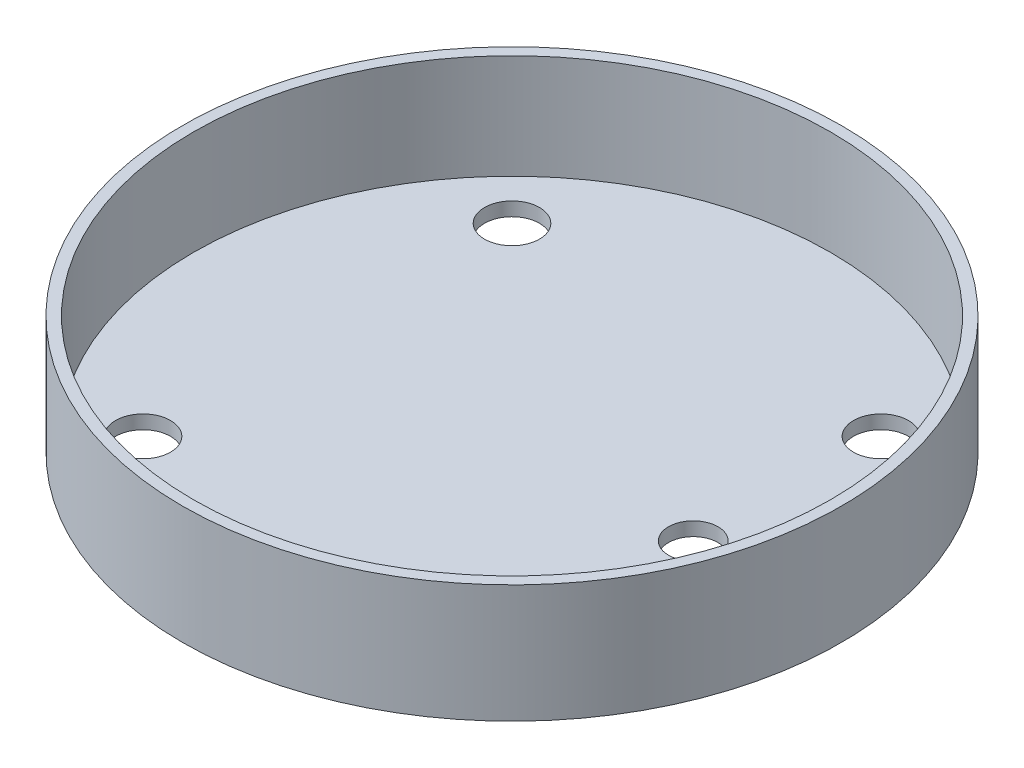
ISO-10303-21;
HEADER;
FILE_DESCRIPTION(('STEP AP214'),'2;1');
FILE_NAME('part.step','',(''),(''),'','','');
FILE_SCHEMA(('AUTOMOTIVE_DESIGN { 1 0 10303 214 1 1 1 1 }'));
ENDSEC;
DATA;
#1=APPLICATION_CONTEXT('core data for automotive mechanical design processes');
#2=APPLICATION_PROTOCOL_DEFINITION('international standard','automotive_design',2000,#1);
#3=PRODUCT_CONTEXT('',#1,'mechanical');
#4=PRODUCT('Part','Part','',(#3));
#5=PRODUCT_RELATED_PRODUCT_CATEGORY('part','',(#4));
#6=PRODUCT_DEFINITION_FORMATION('','',#4);
#7=PRODUCT_DEFINITION_CONTEXT('part definition',#1,'design');
#8=PRODUCT_DEFINITION('design','',#6,#7);
#9=PRODUCT_DEFINITION_SHAPE('','',#8);
#10=(LENGTH_UNIT() NAMED_UNIT(*) SI_UNIT(.MILLI.,.METRE.));
#11=(NAMED_UNIT(*) PLANE_ANGLE_UNIT() SI_UNIT($,.RADIAN.));
#12=(NAMED_UNIT(*) SI_UNIT($,.STERADIAN.) SOLID_ANGLE_UNIT());
#13=UNCERTAINTY_MEASURE_WITH_UNIT(LENGTH_MEASURE(1.E-05),#10,'distance_accuracy_value','');
#14=(GEOMETRIC_REPRESENTATION_CONTEXT(3) GLOBAL_UNCERTAINTY_ASSIGNED_CONTEXT((#13)) GLOBAL_UNIT_ASSIGNED_CONTEXT((#10,
#11,#12)) REPRESENTATION_CONTEXT('',''));
#15=CARTESIAN_POINT('',(0.,0.,0.));
#16=DIRECTION('',(0.,0.,1.));
#17=DIRECTION('',(1.,0.,0.));
#18=AXIS2_PLACEMENT_3D('',#15,#16,#17);
#19=CARTESIAN_POINT('',(0.,2.5,0.));
#20=DIRECTION('',(0.,-1.,0.));
#21=DIRECTION('',(0.,0.,-1.));
#22=AXIS2_PLACEMENT_3D('',#19,#20,#21);
#23=CYLINDRICAL_SURFACE('',#22,60.);
#24=CARTESIAN_POINT('',(0.,0.,0.));
#25=DIRECTION('',(0.,1.,0.));
#26=DIRECTION('',(0.,0.,1.));
#27=AXIS2_PLACEMENT_3D('',#24,#25,#26);
#28=CIRCLE('',#27,60.);
#29=CARTESIAN_POINT('',(0.,0.,60.));
#30=VERTEX_POINT('',#29);
#31=EDGE_CURVE('E41',#30,#30,#28,.T.);
#32=ORIENTED_EDGE('',*,*,#31,.T.);
#33=EDGE_LOOP('',(#32));
#34=FACE_BOUND('',#33,.T.);
#35=CARTESIAN_POINT('',(0.,21.5,0.));
#36=DIRECTION('',(0.,1.,0.));
#37=DIRECTION('',(0.,0.,1.));
#38=AXIS2_PLACEMENT_3D('',#35,#36,#37);
#39=CIRCLE('',#38,60.);
#40=CARTESIAN_POINT('',(0.,21.5,60.));
#41=VERTEX_POINT('',#40);
#42=EDGE_CURVE('E45',#41,#41,#39,.T.);
#43=ORIENTED_EDGE('',*,*,#42,.F.);
#44=EDGE_LOOP('',(#43));
#45=FACE_BOUND('',#44,.T.);
#46=ADVANCED_FACE('F35',(#34,#45),#23,.T.);
#47=CARTESIAN_POINT('',(0.,0.,0.));
#48=DIRECTION('',(0.,1.,0.));
#49=DIRECTION('',(0.,0.,1.));
#50=AXIS2_PLACEMENT_3D('',#47,#48,#49);
#51=PLANE('',#50);
#52=CARTESIAN_POINT('',(-33.5875721063611,0.,-33.5875721063591));
#53=DIRECTION('',(0.,1.,0.));
#54=DIRECTION('',(0.,0.,1.));
#55=AXIS2_PLACEMENT_3D('',#52,#53,#54);
#56=CIRCLE('',#55,5.000000000002);
#57=CARTESIAN_POINT('',(-33.5875721063611,0.,-28.5875721063571));
#58=VERTEX_POINT('',#57);
#59=EDGE_CURVE('E64',#58,#58,#56,.T.);
#60=ORIENTED_EDGE('',*,*,#59,.T.);
#61=EDGE_LOOP('',(#60));
#62=FACE_BOUND('',#61,.T.);
#63=CARTESIAN_POINT('',(-33.5875721063591,0.,33.5875721063629));
#64=DIRECTION('',(0.,1.,0.));
#65=DIRECTION('',(0.,0.,1.));
#66=AXIS2_PLACEMENT_3D('',#63,#64,#65);
#67=CIRCLE('',#66,5.00000000000138);
#68=CARTESIAN_POINT('',(-33.5875721063591,0.,38.5875721063643));
#69=VERTEX_POINT('',#68);
#70=EDGE_CURVE('E70',#69,#69,#67,.T.);
#71=ORIENTED_EDGE('',*,*,#70,.T.);
#72=EDGE_LOOP('',(#71));
#73=FACE_BOUND('',#72,.T.);
#74=CARTESIAN_POINT('',(33.5875721063629,0.,33.5875721063609));
#75=DIRECTION('',(0.,1.,0.));
#76=DIRECTION('',(0.,0.,1.));
#77=AXIS2_PLACEMENT_3D('',#74,#75,#76);
#78=CIRCLE('',#77,4.99999999999954);
#79=CARTESIAN_POINT('',(33.5875721063629,0.,38.5875721063605));
#80=VERTEX_POINT('',#79);
#81=EDGE_CURVE('E76',#80,#80,#78,.T.);
#82=ORIENTED_EDGE('',*,*,#81,.T.);
#83=EDGE_LOOP('',(#82));
#84=FACE_BOUND('',#83,.T.);
#85=CARTESIAN_POINT('',(33.5875721063609,0.,-33.5875721063611));
#86=DIRECTION('',(0.,1.,0.));
#87=DIRECTION('',(0.,0.,1.));
#88=AXIS2_PLACEMENT_3D('',#85,#86,#87);
#89=CIRCLE('',#88,5.);
#90=CARTESIAN_POINT('',(33.5875721063609,0.,-28.5875721063611));
#91=VERTEX_POINT('',#90);
#92=EDGE_CURVE('E58',#91,#91,#89,.T.);
#93=ORIENTED_EDGE('',*,*,#92,.T.);
#94=EDGE_LOOP('',(#93));
#95=FACE_BOUND('',#94,.T.);
#96=CARTESIAN_POINT('',(33.,0.,0.));
#97=DIRECTION('',(0.,1.,0.));
#98=DIRECTION('',(0.,0.,1.));
#99=AXIS2_PLACEMENT_3D('',#96,#97,#98);
#100=CIRCLE('',#99,4.5);
#101=CARTESIAN_POINT('',(33.,0.,4.5));
#102=VERTEX_POINT('',#101);
#103=EDGE_CURVE('E54',#102,#102,#100,.T.);
#104=ORIENTED_EDGE('',*,*,#103,.T.);
#105=EDGE_LOOP('',(#104));
#106=FACE_BOUND('',#105,.T.);
#107=ORIENTED_EDGE('',*,*,#31,.F.);
#108=EDGE_LOOP('',(#107));
#109=FACE_BOUND('',#108,.T.);
#110=ADVANCED_FACE('F85',(#62,#73,#84,#95,#106,#109),#51,.F.);
#111=CARTESIAN_POINT('',(0.,21.5,0.));
#112=DIRECTION('',(0.,1.,0.));
#113=DIRECTION('',(0.,0.,1.));
#114=AXIS2_PLACEMENT_3D('',#111,#112,#113);
#115=PLANE('',#114);
#116=ORIENTED_EDGE('',*,*,#42,.T.);
#117=EDGE_LOOP('',(#116));
#118=FACE_BOUND('',#117,.T.);
#119=CARTESIAN_POINT('',(0.,21.5,0.));
#120=DIRECTION('',(0.,1.,0.));
#121=DIRECTION('',(0.,0.,1.));
#122=AXIS2_PLACEMENT_3D('',#119,#120,#121);
#123=CIRCLE('',#122,58.);
#124=CARTESIAN_POINT('',(0.,21.5,58.));
#125=VERTEX_POINT('',#124);
#126=EDGE_CURVE('E49',#125,#125,#123,.T.);
#127=ORIENTED_EDGE('',*,*,#126,.F.);
#128=EDGE_LOOP('',(#127));
#129=FACE_BOUND('',#128,.T.);
#130=ADVANCED_FACE('F118',(#118,#129),#115,.T.);
#131=CARTESIAN_POINT('',(0.,21.5,0.));
#132=DIRECTION('',(0.,-1.,0.));
#133=DIRECTION('',(0.,0.,-1.));
#134=AXIS2_PLACEMENT_3D('',#131,#132,#133);
#135=CYLINDRICAL_SURFACE('',#134,58.);
#136=ORIENTED_EDGE('',*,*,#126,.T.);
#137=EDGE_LOOP('',(#136));
#138=FACE_BOUND('',#137,.T.);
#139=CARTESIAN_POINT('',(0.,2.5,0.));
#140=DIRECTION('',(0.,1.,0.));
#141=DIRECTION('',(0.,0.,1.));
#142=AXIS2_PLACEMENT_3D('',#139,#140,#141);
#143=CIRCLE('',#142,58.);
#144=CARTESIAN_POINT('',(0.,2.5,58.));
#145=VERTEX_POINT('',#144);
#146=EDGE_CURVE('E10',#145,#145,#143,.F.);
#147=ORIENTED_EDGE('',*,*,#146,.T.);
#148=EDGE_LOOP('',(#147));
#149=FACE_BOUND('',#148,.T.);
#150=ADVANCED_FACE('F99',(#138,#149),#135,.F.);
#151=CARTESIAN_POINT('',(0.,2.5,0.));
#152=DIRECTION('',(0.,1.,0.));
#153=DIRECTION('',(0.,0.,1.));
#154=AXIS2_PLACEMENT_3D('',#151,#152,#153);
#155=PLANE('',#154);
#156=CARTESIAN_POINT('',(-33.5875721063611,2.5,-33.5875721063591));
#157=DIRECTION('',(0.,1.,0.));
#158=DIRECTION('',(0.,0.,1.));
#159=AXIS2_PLACEMENT_3D('',#156,#157,#158);
#160=CIRCLE('',#159,5.000000000002);
#161=CARTESIAN_POINT('',(-33.5875721063611,2.5,-28.5875721063571));
#162=VERTEX_POINT('',#161);
#163=EDGE_CURVE('E61',#162,#162,#160,.T.);
#164=ORIENTED_EDGE('',*,*,#163,.F.);
#165=EDGE_LOOP('',(#164));
#166=FACE_BOUND('',#165,.T.);
#167=CARTESIAN_POINT('',(-33.5875721063591,2.5,33.5875721063629));
#168=DIRECTION('',(0.,1.,0.));
#169=DIRECTION('',(0.,0.,1.));
#170=AXIS2_PLACEMENT_3D('',#167,#168,#169);
#171=CIRCLE('',#170,5.00000000000138);
#172=CARTESIAN_POINT('',(-33.5875721063591,2.5,38.5875721063643));
#173=VERTEX_POINT('',#172);
#174=EDGE_CURVE('E67',#173,#173,#171,.T.);
#175=ORIENTED_EDGE('',*,*,#174,.F.);
#176=EDGE_LOOP('',(#175));
#177=FACE_BOUND('',#176,.T.);
#178=CARTESIAN_POINT('',(33.5875721063629,2.5,33.5875721063609));
#179=DIRECTION('',(0.,1.,0.));
#180=DIRECTION('',(0.,0.,1.));
#181=AXIS2_PLACEMENT_3D('',#178,#179,#180);
#182=CIRCLE('',#181,4.99999999999954);
#183=CARTESIAN_POINT('',(33.5875721063629,2.5,38.5875721063605));
#184=VERTEX_POINT('',#183);
#185=EDGE_CURVE('E73',#184,#184,#182,.T.);
#186=ORIENTED_EDGE('',*,*,#185,.F.);
#187=EDGE_LOOP('',(#186));
#188=FACE_BOUND('',#187,.T.);
#189=CARTESIAN_POINT('',(33.5875721063609,2.5,-33.5875721063611));
#190=DIRECTION('',(0.,1.,0.));
#191=DIRECTION('',(0.,0.,1.));
#192=AXIS2_PLACEMENT_3D('',#189,#190,#191);
#193=CIRCLE('',#192,5.);
#194=CARTESIAN_POINT('',(33.5875721063609,2.5,-28.5875721063611));
#195=VERTEX_POINT('',#194);
#196=EDGE_CURVE('E79',#195,#195,#193,.T.);
#197=ORIENTED_EDGE('',*,*,#196,.F.);
#198=EDGE_LOOP('',(#197));
#199=FACE_BOUND('',#198,.T.);
#200=CARTESIAN_POINT('',(33.,2.5,0.));
#201=DIRECTION('',(0.,1.,0.));
#202=DIRECTION('',(0.,0.,1.));
#203=AXIS2_PLACEMENT_3D('',#200,#201,#202);
#204=CIRCLE('',#203,4.5);
#205=CARTESIAN_POINT('',(33.,2.5,4.5));
#206=VERTEX_POINT('',#205);
#207=EDGE_CURVE('E55',#206,#206,#204,.T.);
#208=ORIENTED_EDGE('',*,*,#207,.F.);
#209=EDGE_LOOP('',(#208));
#210=FACE_BOUND('',#209,.T.);
#211=ORIENTED_EDGE('',*,*,#146,.F.);
#212=EDGE_LOOP('',(#211));
#213=FACE_BOUND('',#212,.T.);
#214=ADVANCED_FACE('F96',(#166,#177,#188,#199,#210,#213),#155,.T.);
#215=CARTESIAN_POINT('',(33.,0.,0.));
#216=DIRECTION('',(0.,1.,0.));
#217=DIRECTION('',(0.,0.,1.));
#218=AXIS2_PLACEMENT_3D('',#215,#216,#217);
#219=CYLINDRICAL_SURFACE('',#218,4.5);
#220=ORIENTED_EDGE('',*,*,#103,.F.);
#221=EDGE_LOOP('',(#220));
#222=FACE_BOUND('',#221,.T.);
#223=ORIENTED_EDGE('',*,*,#207,.T.);
#224=EDGE_LOOP('',(#223));
#225=FACE_BOUND('',#224,.T.);
#226=ADVANCED_FACE('F92',(#222,#225),#219,.F.);
#227=CARTESIAN_POINT('',(33.5875721063609,0.,-33.5875721063611));
#228=DIRECTION('',(0.,1.,0.));
#229=DIRECTION('',(0.,0.,1.));
#230=AXIS2_PLACEMENT_3D('',#227,#228,#229);
#231=CYLINDRICAL_SURFACE('',#230,5.);
#232=ORIENTED_EDGE('',*,*,#92,.F.);
#233=EDGE_LOOP('',(#232));
#234=FACE_BOUND('',#233,.T.);
#235=ORIENTED_EDGE('',*,*,#196,.T.);
#236=EDGE_LOOP('',(#235));
#237=FACE_BOUND('',#236,.T.);
#238=ADVANCED_FACE('F88',(#234,#237),#231,.F.);
#239=CARTESIAN_POINT('',(33.5875721063629,0.,33.5875721063609));
#240=DIRECTION('',(0.,1.,0.));
#241=DIRECTION('',(0.,0.,1.));
#242=AXIS2_PLACEMENT_3D('',#239,#240,#241);
#243=CYLINDRICAL_SURFACE('',#242,4.99999999999954);
#244=ORIENTED_EDGE('',*,*,#81,.F.);
#245=EDGE_LOOP('',(#244));
#246=FACE_BOUND('',#245,.T.);
#247=ORIENTED_EDGE('',*,*,#185,.T.);
#248=EDGE_LOOP('',(#247));
#249=FACE_BOUND('',#248,.T.);
#250=ADVANCED_FACE('F91',(#246,#249),#243,.F.);
#251=CARTESIAN_POINT('',(-33.5875721063591,0.,33.5875721063629));
#252=DIRECTION('',(0.,1.,0.));
#253=DIRECTION('',(0.,0.,1.));
#254=AXIS2_PLACEMENT_3D('',#251,#252,#253);
#255=CYLINDRICAL_SURFACE('',#254,5.00000000000138);
#256=ORIENTED_EDGE('',*,*,#70,.F.);
#257=EDGE_LOOP('',(#256));
#258=FACE_BOUND('',#257,.T.);
#259=ORIENTED_EDGE('',*,*,#174,.T.);
#260=EDGE_LOOP('',(#259));
#261=FACE_BOUND('',#260,.T.);
#262=ADVANCED_FACE('F160',(#258,#261),#255,.F.);
#263=CARTESIAN_POINT('',(-33.5875721063611,0.,-33.5875721063591));
#264=DIRECTION('',(0.,1.,0.));
#265=DIRECTION('',(0.,0.,1.));
#266=AXIS2_PLACEMENT_3D('',#263,#264,#265);
#267=CYLINDRICAL_SURFACE('',#266,5.000000000002);
#268=ORIENTED_EDGE('',*,*,#59,.F.);
#269=EDGE_LOOP('',(#268));
#270=FACE_BOUND('',#269,.T.);
#271=ORIENTED_EDGE('',*,*,#163,.T.);
#272=EDGE_LOOP('',(#271));
#273=FACE_BOUND('',#272,.T.);
#274=ADVANCED_FACE('F168',(#270,#273),#267,.F.);
#275=CLOSED_SHELL('',(#46,#110,#130,#150,#214,#226,#238,#250,#262,#274));
#276=MANIFOLD_SOLID_BREP('B2',#275);
#277=ADVANCED_BREP_SHAPE_REPRESENTATION('',(#18,#276),#14);
#278=SHAPE_DEFINITION_REPRESENTATION(#9,#277);
ENDSEC;
END-ISO-10303-21;
